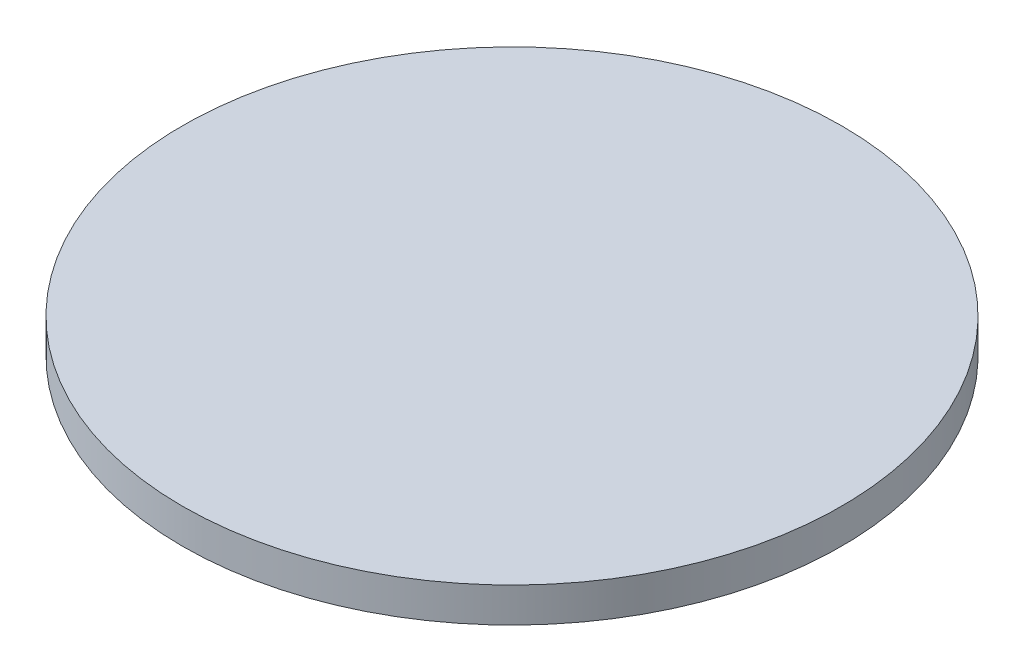
ISO-10303-21;
HEADER;
FILE_DESCRIPTION(('STEP AP214'),'2;1');
FILE_NAME('part.step','',(''),(''),'','','');
FILE_SCHEMA(('AUTOMOTIVE_DESIGN { 1 0 10303 214 1 1 1 1 }'));
ENDSEC;
DATA;
#1=APPLICATION_CONTEXT('core data for automotive mechanical design processes');
#2=APPLICATION_PROTOCOL_DEFINITION('international standard','automotive_design',2000,#1);
#3=PRODUCT_CONTEXT('',#1,'mechanical');
#4=PRODUCT('Part','Part','',(#3));
#5=PRODUCT_RELATED_PRODUCT_CATEGORY('part','',(#4));
#6=PRODUCT_DEFINITION_FORMATION('','',#4);
#7=PRODUCT_DEFINITION_CONTEXT('part definition',#1,'design');
#8=PRODUCT_DEFINITION('design','',#6,#7);
#9=PRODUCT_DEFINITION_SHAPE('','',#8);
#10=(LENGTH_UNIT() NAMED_UNIT(*) SI_UNIT(.MILLI.,.METRE.));
#11=(NAMED_UNIT(*) PLANE_ANGLE_UNIT() SI_UNIT($,.RADIAN.));
#12=(NAMED_UNIT(*) SI_UNIT($,.STERADIAN.) SOLID_ANGLE_UNIT());
#13=UNCERTAINTY_MEASURE_WITH_UNIT(LENGTH_MEASURE(1.E-05),#10,'distance_accuracy_value','');
#14=(GEOMETRIC_REPRESENTATION_CONTEXT(3) GLOBAL_UNCERTAINTY_ASSIGNED_CONTEXT((#13)) GLOBAL_UNIT_ASSIGNED_CONTEXT((#10,
#11,#12)) REPRESENTATION_CONTEXT('',''));
#15=CARTESIAN_POINT('',(0.,0.,0.));
#16=DIRECTION('',(0.,0.,1.));
#17=DIRECTION('',(1.,0.,0.));
#18=AXIS2_PLACEMENT_3D('',#15,#16,#17);
#19=CARTESIAN_POINT('',(0.,12.7,0.));
#20=DIRECTION('',(0.,-1.,0.));
#21=DIRECTION('',(0.,0.,-1.));
#22=AXIS2_PLACEMENT_3D('',#19,#20,#21);
#23=CYLINDRICAL_SURFACE('',#22,120.65);
#24=CARTESIAN_POINT('',(0.,12.7,0.));
#25=DIRECTION('',(0.,1.,0.));
#26=DIRECTION('',(0.,0.,1.));
#27=AXIS2_PLACEMENT_3D('',#24,#25,#26);
#28=CIRCLE('',#27,120.65);
#29=CARTESIAN_POINT('',(0.,12.7,120.65));
#30=VERTEX_POINT('',#29);
#31=EDGE_CURVE('E10',#30,#30,#28,.T.);
#32=ORIENTED_EDGE('',*,*,#31,.F.);
#33=EDGE_LOOP('',(#32));
#34=FACE_BOUND('',#33,.T.);
#35=CARTESIAN_POINT('',(0.,0.,0.));
#36=DIRECTION('',(0.,1.,0.));
#37=DIRECTION('',(0.,0.,1.));
#38=AXIS2_PLACEMENT_3D('',#35,#36,#37);
#39=CIRCLE('',#38,120.65);
#40=CARTESIAN_POINT('',(0.,0.,120.65));
#41=VERTEX_POINT('',#40);
#42=EDGE_CURVE('E33',#41,#41,#39,.T.);
#43=ORIENTED_EDGE('',*,*,#42,.T.);
#44=EDGE_LOOP('',(#43));
#45=FACE_BOUND('',#44,.T.);
#46=ADVANCED_FACE('F30',(#34,#45),#23,.T.);
#47=CARTESIAN_POINT('',(0.,12.7,0.));
#48=DIRECTION('',(0.,1.,0.));
#49=DIRECTION('',(0.,0.,1.));
#50=AXIS2_PLACEMENT_3D('',#47,#48,#49);
#51=PLANE('',#50);
#52=ORIENTED_EDGE('',*,*,#31,.T.);
#53=EDGE_LOOP('',(#52));
#54=FACE_BOUND('',#53,.T.);
#55=ADVANCED_FACE('F45',(#54),#51,.T.);
#56=CARTESIAN_POINT('',(0.,0.,0.));
#57=DIRECTION('',(0.,1.,0.));
#58=DIRECTION('',(0.,0.,1.));
#59=AXIS2_PLACEMENT_3D('',#56,#57,#58);
#60=PLANE('',#59);
#61=ORIENTED_EDGE('',*,*,#42,.F.);
#62=EDGE_LOOP('',(#61));
#63=FACE_BOUND('',#62,.T.);
#64=ADVANCED_FACE('F43',(#63),#60,.F.);
#65=CLOSED_SHELL('',(#46,#55,#64));
#66=MANIFOLD_SOLID_BREP('B2',#65);
#67=ADVANCED_BREP_SHAPE_REPRESENTATION('',(#18,#66),#14);
#68=SHAPE_DEFINITION_REPRESENTATION(#9,#67);
ENDSEC;
END-ISO-10303-21;
